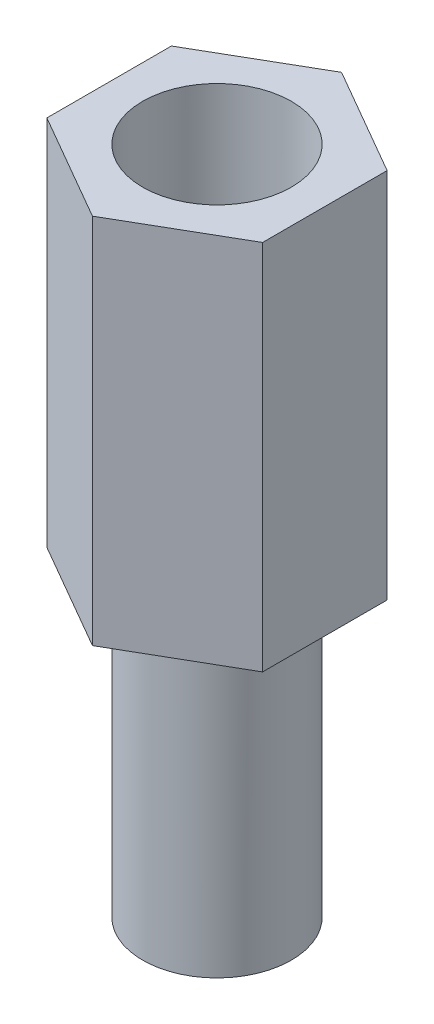
ISO-10303-21;
HEADER;
FILE_DESCRIPTION(('STEP AP214'),'2;1');
FILE_NAME('part.step','',(''),(''),'','','');
FILE_SCHEMA(('AUTOMOTIVE_DESIGN { 1 0 10303 214 1 1 1 1 }'));
ENDSEC;
DATA;
#1=APPLICATION_CONTEXT('core data for automotive mechanical design processes');
#2=APPLICATION_PROTOCOL_DEFINITION('international standard','automotive_design',2000,#1);
#3=PRODUCT_CONTEXT('',#1,'mechanical');
#4=PRODUCT('Part','Part','',(#3));
#5=PRODUCT_RELATED_PRODUCT_CATEGORY('part','',(#4));
#6=PRODUCT_DEFINITION_FORMATION('','',#4);
#7=PRODUCT_DEFINITION_CONTEXT('part definition',#1,'design');
#8=PRODUCT_DEFINITION('design','',#6,#7);
#9=PRODUCT_DEFINITION_SHAPE('','',#8);
#10=(LENGTH_UNIT() NAMED_UNIT(*) SI_UNIT(.MILLI.,.METRE.));
#11=(NAMED_UNIT(*) PLANE_ANGLE_UNIT() SI_UNIT($,.RADIAN.));
#12=(NAMED_UNIT(*) SI_UNIT($,.STERADIAN.) SOLID_ANGLE_UNIT());
#13=UNCERTAINTY_MEASURE_WITH_UNIT(LENGTH_MEASURE(1.E-05),#10,'distance_accuracy_value','');
#14=(GEOMETRIC_REPRESENTATION_CONTEXT(3) GLOBAL_UNCERTAINTY_ASSIGNED_CONTEXT((#13)) GLOBAL_UNIT_ASSIGNED_CONTEXT((#10,
#11,#12)) REPRESENTATION_CONTEXT('',''));
#15=CARTESIAN_POINT('',(0.,0.,0.));
#16=DIRECTION('',(0.,0.,1.));
#17=DIRECTION('',(1.,0.,0.));
#18=AXIS2_PLACEMENT_3D('',#15,#16,#17);
#19=CARTESIAN_POINT('',(0.,5.,0.));
#20=DIRECTION('',(0.,-1.,0.));
#21=DIRECTION('',(0.,0.,-1.));
#22=AXIS2_PLACEMENT_3D('',#19,#20,#21);
#23=CYLINDRICAL_SURFACE('',#22,1.);
#24=CARTESIAN_POINT('',(0.,5.,0.));
#25=DIRECTION('',(0.,1.,0.));
#26=DIRECTION('',(0.,0.,1.));
#27=AXIS2_PLACEMENT_3D('',#24,#25,#26);
#28=CIRCLE('',#27,1.);
#29=CARTESIAN_POINT('',(0.,5.,1.));
#30=VERTEX_POINT('',#29);
#31=EDGE_CURVE('E131',#30,#30,#28,.T.);
#32=ORIENTED_EDGE('',*,*,#31,.T.);
#33=EDGE_LOOP('',(#32));
#34=FACE_BOUND('',#33,.T.);
#35=CARTESIAN_POINT('',(0.,2.,0.));
#36=DIRECTION('',(0.,-1.,0.));
#37=DIRECTION('',(0.,0.,-1.));
#38=AXIS2_PLACEMENT_3D('',#35,#36,#37);
#39=CIRCLE('',#38,1.);
#40=CARTESIAN_POINT('',(0.,2.,-1.));
#41=VERTEX_POINT('',#40);
#42=EDGE_CURVE('E237',#41,#41,#39,.T.);
#43=ORIENTED_EDGE('',*,*,#42,.T.);
#44=EDGE_LOOP('',(#43));
#45=FACE_BOUND('',#44,.T.);
#46=ADVANCED_FACE('F41',(#34,#45),#23,.F.);
#47=CARTESIAN_POINT('',(0.,5.,0.));
#48=DIRECTION('',(0.,1.,0.));
#49=DIRECTION('',(0.,0.,1.));
#50=AXIS2_PLACEMENT_3D('',#47,#48,#49);
#51=PLANE('',#50);
#52=DIRECTION('',(-0.866025403784439,0.,-0.5));
#53=VECTOR('',#52,1.);
#54=CARTESIAN_POINT('',(1.45,5.,-0.837157890324958));
#55=LINE('',#54,#53);
#56=CARTESIAN_POINT('',(1.45,5.,-0.837157890324958));
#57=VERTEX_POINT('',#56);
#58=CARTESIAN_POINT('',(0.,5.,-1.67431578064992));
#59=VERTEX_POINT('',#58);
#60=EDGE_CURVE('E138',#57,#59,#55,.T.);
#61=ORIENTED_EDGE('',*,*,#60,.T.);
#62=DIRECTION('',(-0.866025403784439,0.,0.5));
#63=VECTOR('',#62,1.);
#64=CARTESIAN_POINT('',(0.,5.,-1.67431578064992));
#65=LINE('',#64,#63);
#66=CARTESIAN_POINT('',(-1.45,5.,-0.837157890324958));
#67=VERTEX_POINT('',#66);
#68=EDGE_CURVE('E95',#59,#67,#65,.T.);
#69=ORIENTED_EDGE('',*,*,#68,.T.);
#70=DIRECTION('',(0.,0.,1.));
#71=VECTOR('',#70,1.);
#72=CARTESIAN_POINT('',(-1.45,5.,-0.837157890324958));
#73=LINE('',#72,#71);
#74=CARTESIAN_POINT('',(-1.45,5.,0.837157890324957));
#75=VERTEX_POINT('',#74);
#76=EDGE_CURVE('E109',#67,#75,#73,.T.);
#77=ORIENTED_EDGE('',*,*,#76,.T.);
#78=DIRECTION('',(0.866025403784439,0.,0.5));
#79=VECTOR('',#78,1.);
#80=CARTESIAN_POINT('',(-1.45,5.,0.837157890324957));
#81=LINE('',#80,#79);
#82=CARTESIAN_POINT('',(0.,5.,1.67431578064991));
#83=VERTEX_POINT('',#82);
#84=EDGE_CURVE('E102',#75,#83,#81,.T.);
#85=ORIENTED_EDGE('',*,*,#84,.T.);
#86=DIRECTION('',(0.866025403784439,0.,-0.5));
#87=VECTOR('',#86,1.);
#88=CARTESIAN_POINT('',(0.,5.,1.67431578064991));
#89=LINE('',#88,#87);
#90=CARTESIAN_POINT('',(1.45,5.,0.837157890324957));
#91=VERTEX_POINT('',#90);
#92=EDGE_CURVE('E107',#83,#91,#89,.T.);
#93=ORIENTED_EDGE('',*,*,#92,.T.);
#94=DIRECTION('',(0.,0.,-1.));
#95=VECTOR('',#94,1.);
#96=CARTESIAN_POINT('',(1.45,5.,0.837157890324957));
#97=LINE('',#96,#95);
#98=EDGE_CURVE('E58',#91,#57,#97,.T.);
#99=ORIENTED_EDGE('',*,*,#98,.T.);
#100=EDGE_LOOP('',(#61,#69,#77,#85,#93,#99));
#101=FACE_BOUND('',#100,.T.);
#102=ORIENTED_EDGE('',*,*,#31,.F.);
#103=EDGE_LOOP('',(#102));
#104=FACE_BOUND('',#103,.T.);
#105=ADVANCED_FACE('F104',(#101,#104),#51,.T.);
#106=CARTESIAN_POINT('',(0.,0.,0.));
#107=DIRECTION('',(0.,1.,0.));
#108=DIRECTION('',(0.,0.,1.));
#109=AXIS2_PLACEMENT_3D('',#106,#107,#108);
#110=PLANE('',#109);
#111=DIRECTION('',(-0.866025403784439,0.,-0.5));
#112=VECTOR('',#111,1.);
#113=CARTESIAN_POINT('',(1.45,0.,-0.837157890324958));
#114=LINE('',#113,#112);
#115=CARTESIAN_POINT('',(1.45,0.,-0.837157890324958));
#116=VERTEX_POINT('',#115);
#117=CARTESIAN_POINT('',(0.,0.,-1.67431578064992));
#118=VERTEX_POINT('',#117);
#119=EDGE_CURVE('E127',#116,#118,#114,.T.);
#120=ORIENTED_EDGE('',*,*,#119,.F.);
#121=DIRECTION('',(0.,0.,-1.));
#122=VECTOR('',#121,1.);
#123=CARTESIAN_POINT('',(1.45,0.,0.837157890324957));
#124=LINE('',#123,#122);
#125=CARTESIAN_POINT('',(1.45,0.,0.837157890324957));
#126=VERTEX_POINT('',#125);
#127=EDGE_CURVE('E87',#126,#116,#124,.T.);
#128=ORIENTED_EDGE('',*,*,#127,.F.);
#129=DIRECTION('',(0.866025403784439,0.,-0.5));
#130=VECTOR('',#129,1.);
#131=CARTESIAN_POINT('',(0.,0.,1.67431578064991));
#132=LINE('',#131,#130);
#133=CARTESIAN_POINT('',(0.,0.,1.67431578064991));
#134=VERTEX_POINT('',#133);
#135=EDGE_CURVE('E81',#134,#126,#132,.T.);
#136=ORIENTED_EDGE('',*,*,#135,.F.);
#137=DIRECTION('',(0.866025403784439,0.,0.5));
#138=VECTOR('',#137,1.);
#139=CARTESIAN_POINT('',(-1.45,0.,0.837157890324957));
#140=LINE('',#139,#138);
#141=CARTESIAN_POINT('',(-1.45,0.,0.837157890324957));
#142=VERTEX_POINT('',#141);
#143=EDGE_CURVE('E117',#142,#134,#140,.T.);
#144=ORIENTED_EDGE('',*,*,#143,.F.);
#145=DIRECTION('',(0.,0.,1.));
#146=VECTOR('',#145,1.);
#147=CARTESIAN_POINT('',(-1.45,0.,-0.837157890324958));
#148=LINE('',#147,#146);
#149=CARTESIAN_POINT('',(-1.45,0.,-0.837157890324958));
#150=VERTEX_POINT('',#149);
#151=EDGE_CURVE('E133',#150,#142,#148,.T.);
#152=ORIENTED_EDGE('',*,*,#151,.F.);
#153=DIRECTION('',(-0.866025403784439,0.,0.5));
#154=VECTOR('',#153,1.);
#155=CARTESIAN_POINT('',(0.,0.,-1.67431578064992));
#156=LINE('',#155,#154);
#157=EDGE_CURVE('E130',#118,#150,#156,.T.);
#158=ORIENTED_EDGE('',*,*,#157,.F.);
#159=EDGE_LOOP('',(#120,#128,#136,#144,#152,#158));
#160=FACE_BOUND('',#159,.T.);
#161=CARTESIAN_POINT('',(0.,0.,0.));
#162=DIRECTION('',(0.,1.,0.));
#163=DIRECTION('',(0.,0.,1.));
#164=AXIS2_PLACEMENT_3D('',#161,#162,#163);
#165=CIRCLE('',#164,1.);
#166=CARTESIAN_POINT('',(0.,0.,1.));
#167=VERTEX_POINT('',#166);
#168=EDGE_CURVE('E240',#167,#167,#165,.T.);
#169=ORIENTED_EDGE('',*,*,#168,.T.);
#170=EDGE_LOOP('',(#169));
#171=FACE_BOUND('',#170,.T.);
#172=ADVANCED_FACE('F147',(#160,#171),#110,.F.);
#173=CARTESIAN_POINT('',(1.45,5.,-0.837157890324958));
#174=DIRECTION('',(-0.5,0.,0.866025403784439));
#175=DIRECTION('',(0.866025403784439,0.,0.5));
#176=AXIS2_PLACEMENT_3D('',#173,#174,#175);
#177=PLANE('',#176);
#178=ORIENTED_EDGE('',*,*,#119,.T.);
#179=DIRECTION('',(0.,-1.,0.));
#180=VECTOR('',#179,1.);
#181=CARTESIAN_POINT('',(0.,5.,-1.67431578064992));
#182=LINE('',#181,#180);
#183=EDGE_CURVE('E11',#59,#118,#182,.T.);
#184=ORIENTED_EDGE('',*,*,#183,.F.);
#185=ORIENTED_EDGE('',*,*,#60,.F.);
#186=DIRECTION('',(0.,-1.,0.));
#187=VECTOR('',#186,1.);
#188=CARTESIAN_POINT('',(1.45,5.,-0.837157890324958));
#189=LINE('',#188,#187);
#190=EDGE_CURVE('E123',#57,#116,#189,.T.);
#191=ORIENTED_EDGE('',*,*,#190,.T.);
#192=EDGE_LOOP('',(#178,#184,#185,#191));
#193=FACE_BOUND('',#192,.T.);
#194=ADVANCED_FACE('F43',(#193),#177,.F.);
#195=CARTESIAN_POINT('',(0.,5.,-1.67431578064992));
#196=DIRECTION('',(0.5,0.,0.866025403784439));
#197=DIRECTION('',(0.866025403784439,0.,-0.5));
#198=AXIS2_PLACEMENT_3D('',#195,#196,#197);
#199=PLANE('',#198);
#200=ORIENTED_EDGE('',*,*,#157,.T.);
#201=DIRECTION('',(0.,-1.,0.));
#202=VECTOR('',#201,1.);
#203=CARTESIAN_POINT('',(-1.45,5.,-0.837157890324958));
#204=LINE('',#203,#202);
#205=EDGE_CURVE('E50',#67,#150,#204,.T.);
#206=ORIENTED_EDGE('',*,*,#205,.F.);
#207=ORIENTED_EDGE('',*,*,#68,.F.);
#208=ORIENTED_EDGE('',*,*,#183,.T.);
#209=EDGE_LOOP('',(#200,#206,#207,#208));
#210=FACE_BOUND('',#209,.T.);
#211=ADVANCED_FACE('F179',(#210),#199,.F.);
#212=CARTESIAN_POINT('',(-1.45,5.,-0.837157890324958));
#213=DIRECTION('',(1.,0.,0.));
#214=DIRECTION('',(0.,0.,-1.));
#215=AXIS2_PLACEMENT_3D('',#212,#213,#214);
#216=PLANE('',#215);
#217=ORIENTED_EDGE('',*,*,#151,.T.);
#218=DIRECTION('',(0.,-1.,0.));
#219=VECTOR('',#218,1.);
#220=CARTESIAN_POINT('',(-1.45,5.,0.837157890324957));
#221=LINE('',#220,#219);
#222=EDGE_CURVE('E118',#75,#142,#221,.T.);
#223=ORIENTED_EDGE('',*,*,#222,.F.);
#224=ORIENTED_EDGE('',*,*,#76,.F.);
#225=ORIENTED_EDGE('',*,*,#205,.T.);
#226=EDGE_LOOP('',(#217,#223,#224,#225));
#227=FACE_BOUND('',#226,.T.);
#228=ADVANCED_FACE('F144',(#227),#216,.F.);
#229=CARTESIAN_POINT('',(-1.45,5.,0.837157890324957));
#230=DIRECTION('',(0.5,0.,-0.866025403784439));
#231=DIRECTION('',(-0.866025403784439,0.,-0.5));
#232=AXIS2_PLACEMENT_3D('',#229,#230,#231);
#233=PLANE('',#232);
#234=ORIENTED_EDGE('',*,*,#143,.T.);
#235=DIRECTION('',(0.,-1.,0.));
#236=VECTOR('',#235,1.);
#237=CARTESIAN_POINT('',(0.,5.,1.67431578064991));
#238=LINE('',#237,#236);
#239=EDGE_CURVE('E114',#83,#134,#238,.T.);
#240=ORIENTED_EDGE('',*,*,#239,.F.);
#241=ORIENTED_EDGE('',*,*,#84,.F.);
#242=ORIENTED_EDGE('',*,*,#222,.T.);
#243=EDGE_LOOP('',(#234,#240,#241,#242));
#244=FACE_BOUND('',#243,.T.);
#245=ADVANCED_FACE('F115',(#244),#233,.F.);
#246=CARTESIAN_POINT('',(0.,5.,1.67431578064991));
#247=DIRECTION('',(-0.5,0.,-0.866025403784439));
#248=DIRECTION('',(-0.866025403784439,0.,0.5));
#249=AXIS2_PLACEMENT_3D('',#246,#247,#248);
#250=PLANE('',#249);
#251=ORIENTED_EDGE('',*,*,#135,.T.);
#252=DIRECTION('',(0.,-1.,0.));
#253=VECTOR('',#252,1.);
#254=CARTESIAN_POINT('',(1.45,5.,0.837157890324957));
#255=LINE('',#254,#253);
#256=EDGE_CURVE('E119',#91,#126,#255,.T.);
#257=ORIENTED_EDGE('',*,*,#256,.F.);
#258=ORIENTED_EDGE('',*,*,#92,.F.);
#259=ORIENTED_EDGE('',*,*,#239,.T.);
#260=EDGE_LOOP('',(#251,#257,#258,#259));
#261=FACE_BOUND('',#260,.T.);
#262=ADVANCED_FACE('F121',(#261),#250,.F.);
#263=CARTESIAN_POINT('',(1.45,5.,0.837157890324957));
#264=DIRECTION('',(-1.,0.,0.));
#265=DIRECTION('',(0.,0.,1.));
#266=AXIS2_PLACEMENT_3D('',#263,#264,#265);
#267=PLANE('',#266);
#268=ORIENTED_EDGE('',*,*,#127,.T.);
#269=ORIENTED_EDGE('',*,*,#190,.F.);
#270=ORIENTED_EDGE('',*,*,#98,.F.);
#271=ORIENTED_EDGE('',*,*,#256,.T.);
#272=EDGE_LOOP('',(#268,#269,#270,#271));
#273=FACE_BOUND('',#272,.T.);
#274=ADVANCED_FACE('F152',(#273),#267,.F.);
#275=CARTESIAN_POINT('',(0.,2.,0.));
#276=DIRECTION('',(0.,-1.,0.));
#277=DIRECTION('',(0.,0.,-1.));
#278=AXIS2_PLACEMENT_3D('',#275,#276,#277);
#279=PLANE('',#278);
#280=ORIENTED_EDGE('',*,*,#42,.F.);
#281=EDGE_LOOP('',(#280));
#282=FACE_BOUND('',#281,.T.);
#283=ADVANCED_FACE('F154',(#282),#279,.F.);
#284=CARTESIAN_POINT('',(0.,2.,0.));
#285=DIRECTION('',(0.,-1.,0.));
#286=DIRECTION('',(0.,0.,-1.));
#287=AXIS2_PLACEMENT_3D('',#284,#285,#286);
#288=CYLINDRICAL_SURFACE('',#287,1.);
#289=CARTESIAN_POINT('',(0.,-4.,0.));
#290=DIRECTION('',(0.,-1.,0.));
#291=DIRECTION('',(0.,0.,-1.));
#292=AXIS2_PLACEMENT_3D('',#289,#290,#291);
#293=CIRCLE('',#292,1.);
#294=CARTESIAN_POINT('',(0.,-4.,-1.));
#295=VERTEX_POINT('',#294);
#296=EDGE_CURVE('E236',#295,#295,#293,.T.);
#297=ORIENTED_EDGE('',*,*,#296,.F.);
#298=EDGE_LOOP('',(#297));
#299=FACE_BOUND('',#298,.T.);
#300=ORIENTED_EDGE('',*,*,#168,.F.);
#301=EDGE_LOOP('',(#300));
#302=FACE_BOUND('',#301,.T.);
#303=ADVANCED_FACE('F161',(#299,#302),#288,.T.);
#304=CARTESIAN_POINT('',(0.,-4.,0.));
#305=DIRECTION('',(0.,-1.,0.));
#306=DIRECTION('',(0.,0.,-1.));
#307=AXIS2_PLACEMENT_3D('',#304,#305,#306);
#308=PLANE('',#307);
#309=ORIENTED_EDGE('',*,*,#296,.T.);
#310=EDGE_LOOP('',(#309));
#311=FACE_BOUND('',#310,.T.);
#312=ADVANCED_FACE('F222',(#311),#308,.T.);
#313=CLOSED_SHELL('',(#46,#105,#172,#194,#211,#228,#245,#262,#274,#283,#303,#312));
#314=MANIFOLD_SOLID_BREP('B2',#313);
#315=ADVANCED_BREP_SHAPE_REPRESENTATION('',(#18,#314),#14);
#316=SHAPE_DEFINITION_REPRESENTATION(#9,#315);
ENDSEC;
END-ISO-10303-21;
